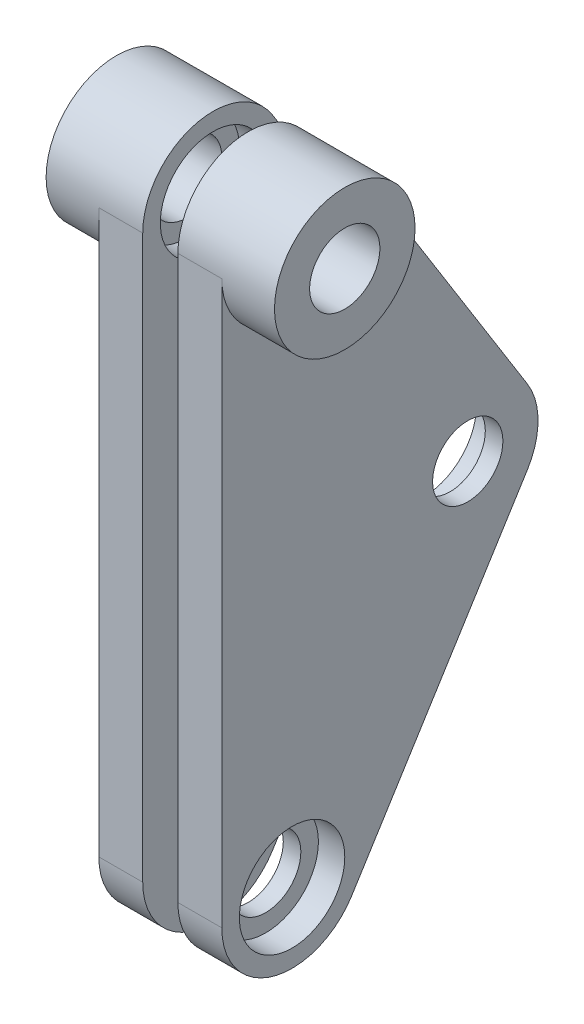
ISO-10303-21;
HEADER;
FILE_DESCRIPTION(('STEP AP214'),'2;1');
FILE_NAME('part.step','',(''),(''),'','','');
FILE_SCHEMA(('AUTOMOTIVE_DESIGN { 1 0 10303 214 1 1 1 1 }'));
ENDSEC;
DATA;
#1=APPLICATION_CONTEXT('core data for automotive mechanical design processes');
#2=APPLICATION_PROTOCOL_DEFINITION('international standard','automotive_design',2000,#1);
#3=PRODUCT_CONTEXT('',#1,'mechanical');
#4=PRODUCT('Part','Part','',(#3));
#5=PRODUCT_RELATED_PRODUCT_CATEGORY('part','',(#4));
#6=PRODUCT_DEFINITION_FORMATION('','',#4);
#7=PRODUCT_DEFINITION_CONTEXT('part definition',#1,'design');
#8=PRODUCT_DEFINITION('design','',#6,#7);
#9=PRODUCT_DEFINITION_SHAPE('','',#8);
#10=(LENGTH_UNIT() NAMED_UNIT(*) SI_UNIT(.MILLI.,.METRE.));
#11=(NAMED_UNIT(*) PLANE_ANGLE_UNIT() SI_UNIT($,.RADIAN.));
#12=(NAMED_UNIT(*) SI_UNIT($,.STERADIAN.) SOLID_ANGLE_UNIT());
#13=UNCERTAINTY_MEASURE_WITH_UNIT(LENGTH_MEASURE(1.E-05),#10,'distance_accuracy_value','');
#14=(GEOMETRIC_REPRESENTATION_CONTEXT(3) GLOBAL_UNCERTAINTY_ASSIGNED_CONTEXT((#13)) GLOBAL_UNIT_ASSIGNED_CONTEXT((#10,
#11,#12)) REPRESENTATION_CONTEXT('',''));
#15=CARTESIAN_POINT('',(0.,0.,0.));
#16=DIRECTION('',(0.,0.,1.));
#17=DIRECTION('',(1.,0.,0.));
#18=AXIS2_PLACEMENT_3D('',#15,#16,#17);
#19=CARTESIAN_POINT('',(4.5,-4.,-4.));
#20=DIRECTION('',(1.,0.,0.));
#21=DIRECTION('',(0.,0.,1.));
#22=AXIS2_PLACEMENT_3D('',#19,#20,#21);
#23=CYLINDRICAL_SURFACE('',#22,2.);
#24=CARTESIAN_POINT('',(10.,-4.,-4.));
#25=DIRECTION('',(1.,0.,0.));
#26=DIRECTION('',(0.,0.,-1.));
#27=AXIS2_PLACEMENT_3D('',#24,#25,#26);
#28=CIRCLE('',#27,2.);
#29=CARTESIAN_POINT('',(10.,-4.,-6.));
#30=VERTEX_POINT('',#29);
#31=EDGE_CURVE('E220',#30,#30,#28,.T.);
#32=ORIENTED_EDGE('',*,*,#31,.T.);
#33=EDGE_LOOP('',(#32));
#34=FACE_BOUND('',#33,.T.);
#35=CARTESIAN_POINT('',(6.,-4.,-4.));
#36=DIRECTION('',(1.,0.,0.));
#37=DIRECTION('',(0.,0.,-1.));
#38=AXIS2_PLACEMENT_3D('',#35,#36,#37);
#39=CIRCLE('',#38,2.);
#40=CARTESIAN_POINT('',(6.,-4.,-6.));
#41=VERTEX_POINT('',#40);
#42=EDGE_CURVE('E223',#41,#41,#39,.F.);
#43=ORIENTED_EDGE('',*,*,#42,.T.);
#44=EDGE_LOOP('',(#43));
#45=FACE_BOUND('',#44,.T.);
#46=ADVANCED_FACE('F110',(#34,#45),#23,.F.);
#47=CARTESIAN_POINT('',(4.5,-20.,-14.));
#48=DIRECTION('',(1.,0.,0.));
#49=DIRECTION('',(0.,0.,1.));
#50=AXIS2_PLACEMENT_3D('',#47,#48,#49);
#51=CYLINDRICAL_SURFACE('',#50,2.);
#52=CARTESIAN_POINT('',(7.,-20.,-14.));
#53=DIRECTION('',(1.,0.,0.));
#54=DIRECTION('',(0.,0.,-1.));
#55=AXIS2_PLACEMENT_3D('',#52,#53,#54);
#56=CIRCLE('',#55,2.);
#57=CARTESIAN_POINT('',(7.,-20.,-16.));
#58=VERTEX_POINT('',#57);
#59=EDGE_CURVE('E241',#58,#58,#56,.F.);
#60=ORIENTED_EDGE('',*,*,#59,.F.);
#61=EDGE_LOOP('',(#60));
#62=FACE_BOUND('',#61,.T.);
#63=CARTESIAN_POINT('',(6.,-20.,-14.));
#64=DIRECTION('',(1.,0.,0.));
#65=DIRECTION('',(0.,0.,-1.));
#66=AXIS2_PLACEMENT_3D('',#63,#64,#65);
#67=CIRCLE('',#66,2.);
#68=CARTESIAN_POINT('',(6.,-20.,-16.));
#69=VERTEX_POINT('',#68);
#70=EDGE_CURVE('E213',#69,#69,#67,.T.);
#71=ORIENTED_EDGE('',*,*,#70,.F.);
#72=EDGE_LOOP('',(#71));
#73=FACE_BOUND('',#72,.T.);
#74=ADVANCED_FACE('F264',(#62,#73),#51,.F.);
#75=CARTESIAN_POINT('',(4.5,2.79415306338351,-4.47064490141361));
#76=DIRECTION('',(0.,0.52999894000318,-0.847998304005088));
#77=DIRECTION('',(0.,0.847998304005088,0.52999894000318));
#78=AXIS2_PLACEMENT_3D('',#75,#76,#77);
#79=PLANE('',#78);
#80=DIRECTION('',(0.,-0.847998304005088,-0.52999894000318));
#81=VECTOR('',#80,1.);
#82=CARTESIAN_POINT('',(7.,2.79415306338351,-4.47064490141361));
#83=LINE('',#82,#81);
#84=CARTESIAN_POINT('',(7.,-1.88000423998728,-7.39199321602035));
#85=VERTEX_POINT('',#84);
#86=CARTESIAN_POINT('',(7.,-17.8800042399873,-17.3919932160204));
#87=VERTEX_POINT('',#86);
#88=EDGE_CURVE('E194',#85,#87,#83,.T.);
#89=ORIENTED_EDGE('',*,*,#88,.T.);
#90=DIRECTION('',(1.,0.,0.));
#91=VECTOR('',#90,1.);
#92=CARTESIAN_POINT('',(4.5,-17.8800042399873,-17.3919932160204));
#93=LINE('',#92,#91);
#94=CARTESIAN_POINT('',(4.5,-17.8800042399873,-17.3919932160204));
#95=VERTEX_POINT('',#94);
#96=EDGE_CURVE('E120',#95,#87,#93,.T.);
#97=ORIENTED_EDGE('',*,*,#96,.F.);
#98=DIRECTION('',(0.,-0.847998304005088,-0.52999894000318));
#99=VECTOR('',#98,1.);
#100=CARTESIAN_POINT('',(4.5,2.79415306338351,-4.47064490141361));
#101=LINE('',#100,#99);
#102=CARTESIAN_POINT('',(4.5,-1.88000423998728,-7.39199321602035));
#103=VERTEX_POINT('',#102);
#104=EDGE_CURVE('E187',#103,#95,#101,.T.);
#105=ORIENTED_EDGE('',*,*,#104,.F.);
#106=DIRECTION('',(1.,0.,0.));
#107=VECTOR('',#106,1.);
#108=CARTESIAN_POINT('',(4.5,-1.88000423998728,-7.39199321602035));
#109=LINE('',#108,#107);
#110=EDGE_CURVE('E205',#103,#85,#109,.T.);
#111=ORIENTED_EDGE('',*,*,#110,.T.);
#112=EDGE_LOOP('',(#89,#97,#105,#111));
#113=FACE_BOUND('',#112,.T.);
#114=ADVANCED_FACE('F270',(#113),#79,.T.);
#115=CARTESIAN_POINT('',(4.5,0.,0.));
#116=DIRECTION('',(0.,0.,-1.));
#117=DIRECTION('',(1.,0.,0.));
#118=AXIS2_PLACEMENT_3D('',#115,#116,#117);
#119=PLANE('',#118);
#120=DIRECTION('',(0.,-1.,0.));
#121=VECTOR('',#120,1.);
#122=CARTESIAN_POINT('',(7.,0.,0.));
#123=LINE('',#122,#121);
#124=CARTESIAN_POINT('',(7.,-4.,0.));
#125=VERTEX_POINT('',#124);
#126=CARTESIAN_POINT('',(7.,-36.,0.));
#127=VERTEX_POINT('',#126);
#128=EDGE_CURVE('E197',#125,#127,#123,.T.);
#129=ORIENTED_EDGE('',*,*,#128,.F.);
#130=DIRECTION('',(1.,0.,0.));
#131=VECTOR('',#130,1.);
#132=CARTESIAN_POINT('',(4.5,-4.,0.));
#133=LINE('',#132,#131);
#134=CARTESIAN_POINT('',(4.5,-4.,0.));
#135=VERTEX_POINT('',#134);
#136=EDGE_CURVE('E182',#135,#125,#133,.T.);
#137=ORIENTED_EDGE('',*,*,#136,.F.);
#138=DIRECTION('',(0.,-1.,0.));
#139=VECTOR('',#138,1.);
#140=CARTESIAN_POINT('',(4.5,0.,0.));
#141=LINE('',#140,#139);
#142=CARTESIAN_POINT('',(4.5,-36.,0.));
#143=VERTEX_POINT('',#142);
#144=EDGE_CURVE('E171',#135,#143,#141,.T.);
#145=ORIENTED_EDGE('',*,*,#144,.T.);
#146=DIRECTION('',(1.,0.,0.));
#147=VECTOR('',#146,1.);
#148=CARTESIAN_POINT('',(4.5,-36.,0.));
#149=LINE('',#148,#147);
#150=EDGE_CURVE('E179',#143,#127,#149,.T.);
#151=ORIENTED_EDGE('',*,*,#150,.T.);
#152=EDGE_LOOP('',(#129,#137,#145,#151));
#153=FACE_BOUND('',#152,.T.);
#154=ADVANCED_FACE('F185',(#153),#119,.F.);
#155=CARTESIAN_POINT('',(4.5,-14.0301081195633,-22.4481729913013));
#156=DIRECTION('',(0.,-0.52999894000318,-0.847998304005088));
#157=DIRECTION('',(0.,0.847998304005088,-0.52999894000318));
#158=AXIS2_PLACEMENT_3D('',#155,#156,#157);
#159=PLANE('',#158);
#160=DIRECTION('',(0.,-0.847998304005088,0.52999894000318));
#161=VECTOR('',#160,1.);
#162=CARTESIAN_POINT('',(7.,-14.0301081195633,-22.4481729913013));
#163=LINE('',#162,#161);
#164=CARTESIAN_POINT('',(7.,-22.1199957600127,-17.3919932160204));
#165=VERTEX_POINT('',#164);
#166=CARTESIAN_POINT('',(7.,-38.1199957600127,-7.39199321602035));
#167=VERTEX_POINT('',#166);
#168=EDGE_CURVE('E191',#165,#167,#163,.T.);
#169=ORIENTED_EDGE('',*,*,#168,.T.);
#170=DIRECTION('',(1.,0.,0.));
#171=VECTOR('',#170,1.);
#172=CARTESIAN_POINT('',(4.5,-38.1199957600127,-7.39199321602035));
#173=LINE('',#172,#171);
#174=CARTESIAN_POINT('',(4.5,-38.1199957600127,-7.39199321602035));
#175=VERTEX_POINT('',#174);
#176=EDGE_CURVE('E183',#175,#167,#173,.T.);
#177=ORIENTED_EDGE('',*,*,#176,.F.);
#178=DIRECTION('',(0.,-0.847998304005088,0.52999894000318));
#179=VECTOR('',#178,1.);
#180=CARTESIAN_POINT('',(4.5,-14.0301081195633,-22.4481729913013));
#181=LINE('',#180,#179);
#182=CARTESIAN_POINT('',(4.5,-22.1199957600127,-17.3919932160204));
#183=VERTEX_POINT('',#182);
#184=EDGE_CURVE('E174',#183,#175,#181,.T.);
#185=ORIENTED_EDGE('',*,*,#184,.F.);
#186=DIRECTION('',(1.,0.,0.));
#187=VECTOR('',#186,1.);
#188=CARTESIAN_POINT('',(4.5,-22.1199957600127,-17.3919932160204));
#189=LINE('',#188,#187);
#190=EDGE_CURVE('E189',#183,#165,#189,.T.);
#191=ORIENTED_EDGE('',*,*,#190,.T.);
#192=EDGE_LOOP('',(#169,#177,#185,#191));
#193=FACE_BOUND('',#192,.T.);
#194=ADVANCED_FACE('F288',(#193),#159,.T.);
#195=CARTESIAN_POINT('',(7.,0.,0.));
#196=DIRECTION('',(-1.,0.,0.));
#197=DIRECTION('',(0.,0.,-1.));
#198=AXIS2_PLACEMENT_3D('',#195,#196,#197);
#199=PLANE('',#198);
#200=CARTESIAN_POINT('',(7.,-36.,-4.));
#201=DIRECTION('',(1.,0.,0.));
#202=DIRECTION('',(0.,0.,-1.));
#203=AXIS2_PLACEMENT_3D('',#200,#201,#202);
#204=CIRCLE('',#203,3.);
#205=CARTESIAN_POINT('',(7.,-36.,-7.));
#206=VERTEX_POINT('',#205);
#207=EDGE_CURVE('E411',#206,#206,#204,.T.);
#208=ORIENTED_EDGE('',*,*,#207,.F.);
#209=EDGE_LOOP('',(#208));
#210=FACE_BOUND('',#209,.T.);
#211=ORIENTED_EDGE('',*,*,#59,.T.);
#212=EDGE_LOOP('',(#211));
#213=FACE_BOUND('',#212,.T.);
#214=ORIENTED_EDGE('',*,*,#128,.T.);
#215=CARTESIAN_POINT('',(7.,-36.,-4.));
#216=DIRECTION('',(1.,0.,0.));
#217=DIRECTION('',(0.,0.,-1.));
#218=AXIS2_PLACEMENT_3D('',#215,#216,#217);
#219=CIRCLE('',#218,4.);
#220=EDGE_CURVE('E149',#127,#167,#219,.T.);
#221=ORIENTED_EDGE('',*,*,#220,.T.);
#222=ORIENTED_EDGE('',*,*,#168,.F.);
#223=CARTESIAN_POINT('',(7.,-20.,-14.));
#224=DIRECTION('',(1.,0.,0.));
#225=DIRECTION('',(0.,0.,-1.));
#226=AXIS2_PLACEMENT_3D('',#223,#224,#225);
#227=CIRCLE('',#226,4.);
#228=EDGE_CURVE('E155',#165,#87,#227,.T.);
#229=ORIENTED_EDGE('',*,*,#228,.T.);
#230=ORIENTED_EDGE('',*,*,#88,.F.);
#231=CARTESIAN_POINT('',(7.,-4.,-4.));
#232=DIRECTION('',(1.,0.,0.));
#233=DIRECTION('',(0.,0.,-1.));
#234=AXIS2_PLACEMENT_3D('',#231,#232,#233);
#235=CIRCLE('',#234,4.);
#236=EDGE_CURVE('E13',#125,#85,#235,.T.);
#237=ORIENTED_EDGE('',*,*,#236,.F.);
#238=EDGE_LOOP('',(#214,#221,#222,#229,#230,#237));
#239=FACE_BOUND('',#238,.T.);
#240=ADVANCED_FACE('F284',(#210,#213,#239),#199,.F.);
#241=CARTESIAN_POINT('',(4.5,0.,0.));
#242=DIRECTION('',(-1.,0.,0.));
#243=DIRECTION('',(0.,0.,-1.));
#244=AXIS2_PLACEMENT_3D('',#241,#242,#243);
#245=PLANE('',#244);
#246=CARTESIAN_POINT('',(4.5,-4.,-4.));
#247=DIRECTION('',(1.,0.,0.));
#248=DIRECTION('',(0.,0.,-1.));
#249=AXIS2_PLACEMENT_3D('',#246,#247,#248);
#250=CIRCLE('',#249,3.);
#251=CARTESIAN_POINT('',(4.5,-4.,-7.));
#252=VERTEX_POINT('',#251);
#253=EDGE_CURVE('E228',#252,#252,#250,.T.);
#254=ORIENTED_EDGE('',*,*,#253,.T.);
#255=EDGE_LOOP('',(#254));
#256=FACE_BOUND('',#255,.T.);
#257=CARTESIAN_POINT('',(4.5,-20.,-14.));
#258=DIRECTION('',(1.,0.,0.));
#259=DIRECTION('',(0.,0.,-1.));
#260=AXIS2_PLACEMENT_3D('',#257,#258,#259);
#261=CIRCLE('',#260,3.);
#262=CARTESIAN_POINT('',(4.5,-20.,-17.));
#263=VERTEX_POINT('',#262);
#264=EDGE_CURVE('E234',#263,#263,#261,.T.);
#265=ORIENTED_EDGE('',*,*,#264,.T.);
#266=EDGE_LOOP('',(#265));
#267=FACE_BOUND('',#266,.T.);
#268=CARTESIAN_POINT('',(4.5,-36.,-4.));
#269=DIRECTION('',(1.,0.,0.));
#270=DIRECTION('',(0.,0.,-1.));
#271=AXIS2_PLACEMENT_3D('',#268,#269,#270);
#272=CIRCLE('',#271,2.);
#273=CARTESIAN_POINT('',(4.5,-36.,-6.));
#274=VERTEX_POINT('',#273);
#275=EDGE_CURVE('E215',#274,#274,#272,.T.);
#276=ORIENTED_EDGE('',*,*,#275,.T.);
#277=EDGE_LOOP('',(#276));
#278=FACE_BOUND('',#277,.T.);
#279=ORIENTED_EDGE('',*,*,#184,.T.);
#280=CARTESIAN_POINT('',(4.5,-36.,-4.));
#281=DIRECTION('',(1.,0.,0.));
#282=DIRECTION('',(0.,0.,-1.));
#283=AXIS2_PLACEMENT_3D('',#280,#281,#282);
#284=CIRCLE('',#283,4.);
#285=EDGE_CURVE('E167',#143,#175,#284,.T.);
#286=ORIENTED_EDGE('',*,*,#285,.F.);
#287=ORIENTED_EDGE('',*,*,#144,.F.);
#288=CARTESIAN_POINT('',(4.5,-4.,-4.));
#289=DIRECTION('',(1.,0.,0.));
#290=DIRECTION('',(0.,0.,-1.));
#291=AXIS2_PLACEMENT_3D('',#288,#289,#290);
#292=CIRCLE('',#291,4.);
#293=EDGE_CURVE('E198',#103,#135,#292,.T.);
#294=ORIENTED_EDGE('',*,*,#293,.F.);
#295=ORIENTED_EDGE('',*,*,#104,.T.);
#296=CARTESIAN_POINT('',(4.5,-20.,-14.));
#297=DIRECTION('',(1.,0.,0.));
#298=DIRECTION('',(0.,0.,-1.));
#299=AXIS2_PLACEMENT_3D('',#296,#297,#298);
#300=CIRCLE('',#299,4.);
#301=EDGE_CURVE('E129',#183,#95,#300,.T.);
#302=ORIENTED_EDGE('',*,*,#301,.F.);
#303=EDGE_LOOP('',(#279,#286,#287,#294,#295,#302));
#304=FACE_BOUND('',#303,.T.);
#305=ADVANCED_FACE('F169',(#256,#267,#278,#304),#245,.T.);
#306=CARTESIAN_POINT('',(4.5,-36.,-4.));
#307=DIRECTION('',(1.,0.,0.));
#308=DIRECTION('',(0.,0.,1.));
#309=AXIS2_PLACEMENT_3D('',#306,#307,#308);
#310=CYLINDRICAL_SURFACE('',#309,4.);
#311=ORIENTED_EDGE('',*,*,#285,.T.);
#312=ORIENTED_EDGE('',*,*,#176,.T.);
#313=ORIENTED_EDGE('',*,*,#220,.F.);
#314=ORIENTED_EDGE('',*,*,#150,.F.);
#315=EDGE_LOOP('',(#311,#312,#313,#314));
#316=FACE_BOUND('',#315,.T.);
#317=ADVANCED_FACE('F112',(#316),#310,.T.);
#318=CARTESIAN_POINT('',(4.5,-20.,-14.));
#319=DIRECTION('',(1.,0.,0.));
#320=DIRECTION('',(0.,0.,1.));
#321=AXIS2_PLACEMENT_3D('',#318,#319,#320);
#322=CYLINDRICAL_SURFACE('',#321,4.);
#323=ORIENTED_EDGE('',*,*,#228,.F.);
#324=ORIENTED_EDGE('',*,*,#190,.F.);
#325=ORIENTED_EDGE('',*,*,#301,.T.);
#326=ORIENTED_EDGE('',*,*,#96,.T.);
#327=EDGE_LOOP('',(#323,#324,#325,#326));
#328=FACE_BOUND('',#327,.T.);
#329=ADVANCED_FACE('F252',(#328),#322,.T.);
#330=CARTESIAN_POINT('',(4.5,-4.,-4.));
#331=DIRECTION('',(1.,0.,0.));
#332=DIRECTION('',(0.,0.,1.));
#333=AXIS2_PLACEMENT_3D('',#330,#331,#332);
#334=CYLINDRICAL_SURFACE('',#333,4.);
#335=ORIENTED_EDGE('',*,*,#293,.T.);
#336=ORIENTED_EDGE('',*,*,#136,.T.);
#337=ORIENTED_EDGE('',*,*,#236,.T.);
#338=ORIENTED_EDGE('',*,*,#110,.F.);
#339=EDGE_LOOP('',(#335,#336,#337,#338));
#340=FACE_BOUND('',#339,.T.);
#341=CARTESIAN_POINT('',(10.,-4.,-4.));
#342=DIRECTION('',(1.,0.,0.));
#343=DIRECTION('',(0.,0.,-1.));
#344=AXIS2_PLACEMENT_3D('',#341,#342,#343);
#345=CIRCLE('',#344,4.);
#346=CARTESIAN_POINT('',(10.,-4.,-8.));
#347=VERTEX_POINT('',#346);
#348=EDGE_CURVE('E212',#347,#347,#345,.T.);
#349=ORIENTED_EDGE('',*,*,#348,.F.);
#350=EDGE_LOOP('',(#349));
#351=FACE_BOUND('',#350,.T.);
#352=ADVANCED_FACE('F250',(#340,#351),#334,.T.);
#353=CARTESIAN_POINT('',(10.,-4.,-4.));
#354=DIRECTION('',(-1.,0.,0.));
#355=DIRECTION('',(0.,0.,-1.));
#356=AXIS2_PLACEMENT_3D('',#353,#354,#355);
#357=PLANE('',#356);
#358=ORIENTED_EDGE('',*,*,#31,.F.);
#359=EDGE_LOOP('',(#358));
#360=FACE_BOUND('',#359,.T.);
#361=ORIENTED_EDGE('',*,*,#348,.T.);
#362=EDGE_LOOP('',(#361));
#363=FACE_BOUND('',#362,.T.);
#364=ADVANCED_FACE('F248',(#360,#363),#357,.F.);
#365=CARTESIAN_POINT('',(4.5,-36.,-4.));
#366=DIRECTION('',(1.,0.,0.));
#367=DIRECTION('',(0.,0.,1.));
#368=AXIS2_PLACEMENT_3D('',#365,#366,#367);
#369=CYLINDRICAL_SURFACE('',#368,2.);
#370=CARTESIAN_POINT('',(5.5,-36.,-4.));
#371=DIRECTION('',(1.,0.,0.));
#372=DIRECTION('',(0.,0.,-1.));
#373=AXIS2_PLACEMENT_3D('',#370,#371,#372);
#374=CIRCLE('',#373,2.);
#375=CARTESIAN_POINT('',(5.5,-36.,-6.));
#376=VERTEX_POINT('',#375);
#377=EDGE_CURVE('E114',#376,#376,#374,.T.);
#378=ORIENTED_EDGE('',*,*,#377,.T.);
#379=EDGE_LOOP('',(#378));
#380=FACE_BOUND('',#379,.T.);
#381=ORIENTED_EDGE('',*,*,#275,.F.);
#382=EDGE_LOOP('',(#381));
#383=FACE_BOUND('',#382,.T.);
#384=ADVANCED_FACE('F259',(#380,#383),#369,.F.);
#385=CARTESIAN_POINT('',(6.,-20.,-14.));
#386=DIRECTION('',(-1.,0.,0.));
#387=DIRECTION('',(0.,0.,-1.));
#388=AXIS2_PLACEMENT_3D('',#385,#386,#387);
#389=CYLINDRICAL_SURFACE('',#388,3.);
#390=CARTESIAN_POINT('',(6.,-20.,-14.));
#391=DIRECTION('',(1.,0.,0.));
#392=DIRECTION('',(0.,0.,-1.));
#393=AXIS2_PLACEMENT_3D('',#390,#391,#392);
#394=CIRCLE('',#393,3.);
#395=CARTESIAN_POINT('',(6.,-20.,-17.));
#396=VERTEX_POINT('',#395);
#397=EDGE_CURVE('E237',#396,#396,#394,.T.);
#398=ORIENTED_EDGE('',*,*,#397,.T.);
#399=EDGE_LOOP('',(#398));
#400=FACE_BOUND('',#399,.T.);
#401=ORIENTED_EDGE('',*,*,#264,.F.);
#402=EDGE_LOOP('',(#401));
#403=FACE_BOUND('',#402,.T.);
#404=ADVANCED_FACE('F279',(#400,#403),#389,.F.);
#405=CARTESIAN_POINT('',(6.,-20.,-14.));
#406=DIRECTION('',(-1.,0.,0.));
#407=DIRECTION('',(0.,0.,-1.));
#408=AXIS2_PLACEMENT_3D('',#405,#406,#407);
#409=PLANE('',#408);
#410=ORIENTED_EDGE('',*,*,#70,.T.);
#411=EDGE_LOOP('',(#410));
#412=FACE_BOUND('',#411,.T.);
#413=ORIENTED_EDGE('',*,*,#397,.F.);
#414=EDGE_LOOP('',(#413));
#415=FACE_BOUND('',#414,.T.);
#416=ADVANCED_FACE('F275',(#412,#415),#409,.T.);
#417=CARTESIAN_POINT('',(6.,-4.,-4.));
#418=DIRECTION('',(-1.,0.,0.));
#419=DIRECTION('',(0.,0.,-1.));
#420=AXIS2_PLACEMENT_3D('',#417,#418,#419);
#421=CYLINDRICAL_SURFACE('',#420,3.);
#422=CARTESIAN_POINT('',(6.,-4.,-4.));
#423=DIRECTION('',(1.,0.,0.));
#424=DIRECTION('',(0.,0.,-1.));
#425=AXIS2_PLACEMENT_3D('',#422,#423,#424);
#426=CIRCLE('',#425,3.);
#427=CARTESIAN_POINT('',(6.,-4.,-7.));
#428=VERTEX_POINT('',#427);
#429=EDGE_CURVE('E216',#428,#428,#426,.T.);
#430=ORIENTED_EDGE('',*,*,#429,.T.);
#431=EDGE_LOOP('',(#430));
#432=FACE_BOUND('',#431,.T.);
#433=ORIENTED_EDGE('',*,*,#253,.F.);
#434=EDGE_LOOP('',(#433));
#435=FACE_BOUND('',#434,.T.);
#436=ADVANCED_FACE('F364',(#432,#435),#421,.F.);
#437=CARTESIAN_POINT('',(6.,0.,0.));
#438=DIRECTION('',(-1.,0.,0.));
#439=DIRECTION('',(0.,0.,-1.));
#440=AXIS2_PLACEMENT_3D('',#437,#438,#439);
#441=PLANE('',#440);
#442=ORIENTED_EDGE('',*,*,#42,.F.);
#443=EDGE_LOOP('',(#442));
#444=FACE_BOUND('',#443,.T.);
#445=ORIENTED_EDGE('',*,*,#429,.F.);
#446=EDGE_LOOP('',(#445));
#447=FACE_BOUND('',#446,.T.);
#448=ADVANCED_FACE('F372',(#444,#447),#441,.T.);
#449=CARTESIAN_POINT('',(5.5,-36.,-4.));
#450=DIRECTION('',(1.,0.,0.));
#451=DIRECTION('',(0.,0.,1.));
#452=AXIS2_PLACEMENT_3D('',#449,#450,#451);
#453=CYLINDRICAL_SURFACE('',#452,3.);
#454=CARTESIAN_POINT('',(5.5,-36.,-4.));
#455=DIRECTION('',(1.,0.,0.));
#456=DIRECTION('',(0.,0.,-1.));
#457=AXIS2_PLACEMENT_3D('',#454,#455,#456);
#458=CIRCLE('',#457,3.);
#459=CARTESIAN_POINT('',(5.5,-36.,-7.));
#460=VERTEX_POINT('',#459);
#461=EDGE_CURVE('E410',#460,#460,#458,.T.);
#462=ORIENTED_EDGE('',*,*,#461,.F.);
#463=EDGE_LOOP('',(#462));
#464=FACE_BOUND('',#463,.T.);
#465=ORIENTED_EDGE('',*,*,#207,.T.);
#466=EDGE_LOOP('',(#465));
#467=FACE_BOUND('',#466,.T.);
#468=ADVANCED_FACE('F381',(#464,#467),#453,.F.);
#469=CARTESIAN_POINT('',(5.5,-36.,-4.));
#470=DIRECTION('',(-1.,0.,0.));
#471=DIRECTION('',(0.,0.,-1.));
#472=AXIS2_PLACEMENT_3D('',#469,#470,#471);
#473=PLANE('',#472);
#474=ORIENTED_EDGE('',*,*,#377,.F.);
#475=EDGE_LOOP('',(#474));
#476=FACE_BOUND('',#475,.T.);
#477=ORIENTED_EDGE('',*,*,#461,.T.);
#478=EDGE_LOOP('',(#477));
#479=FACE_BOUND('',#478,.T.);
#480=ADVANCED_FACE('F391',(#476,#479),#473,.F.);
#481=CLOSED_SHELL('',(#46,#74,#114,#154,#194,#240,#305,#317,#329,#352,#364,#384,#404,#416,#436,
#448,#468,#480));
#482=MANIFOLD_SOLID_BREP('B2',#481);
#483=CARTESIAN_POINT('',(2.5,-4.,-4.));
#484=DIRECTION('',(-1.,0.,0.));
#485=DIRECTION('',(0.,0.,1.));
#486=AXIS2_PLACEMENT_3D('',#483,#484,#485);
#487=CYLINDRICAL_SURFACE('',#486,2.);
#488=CARTESIAN_POINT('',(-3.,-4.,-4.));
#489=DIRECTION('',(1.,0.,0.));
#490=DIRECTION('',(0.,0.,-1.));
#491=AXIS2_PLACEMENT_3D('',#488,#489,#490);
#492=CIRCLE('',#491,2.);
#493=CARTESIAN_POINT('',(-3.,-4.,-6.));
#494=VERTEX_POINT('',#493);
#495=EDGE_CURVE('E570',#494,#494,#492,.T.);
#496=ORIENTED_EDGE('',*,*,#495,.F.);
#497=EDGE_LOOP('',(#496));
#498=FACE_BOUND('',#497,.T.);
#499=CARTESIAN_POINT('',(1.,-4.,-4.));
#500=DIRECTION('',(1.,0.,0.));
#501=DIRECTION('',(0.,0.,-1.));
#502=AXIS2_PLACEMENT_3D('',#499,#500,#501);
#503=CIRCLE('',#502,2.);
#504=CARTESIAN_POINT('',(1.,-4.,-6.));
#505=VERTEX_POINT('',#504);
#506=EDGE_CURVE('E573',#505,#505,#503,.F.);
#507=ORIENTED_EDGE('',*,*,#506,.F.);
#508=EDGE_LOOP('',(#507));
#509=FACE_BOUND('',#508,.T.);
#510=ADVANCED_FACE('F457',(#498,#509),#487,.F.);
#511=CARTESIAN_POINT('',(2.5,-20.,-14.));
#512=DIRECTION('',(-1.,0.,0.));
#513=DIRECTION('',(0.,0.,1.));
#514=AXIS2_PLACEMENT_3D('',#511,#512,#513);
#515=CYLINDRICAL_SURFACE('',#514,2.);
#516=CARTESIAN_POINT('',(0.,-20.,-14.));
#517=DIRECTION('',(1.,0.,0.));
#518=DIRECTION('',(0.,0.,-1.));
#519=AXIS2_PLACEMENT_3D('',#516,#517,#518);
#520=CIRCLE('',#519,2.);
#521=CARTESIAN_POINT('',(0.,-20.,-16.));
#522=VERTEX_POINT('',#521);
#523=EDGE_CURVE('E591',#522,#522,#520,.F.);
#524=ORIENTED_EDGE('',*,*,#523,.T.);
#525=EDGE_LOOP('',(#524));
#526=FACE_BOUND('',#525,.T.);
#527=CARTESIAN_POINT('',(1.,-20.,-14.));
#528=DIRECTION('',(1.,0.,0.));
#529=DIRECTION('',(0.,0.,-1.));
#530=AXIS2_PLACEMENT_3D('',#527,#528,#529);
#531=CIRCLE('',#530,2.);
#532=CARTESIAN_POINT('',(1.,-20.,-16.));
#533=VERTEX_POINT('',#532);
#534=EDGE_CURVE('E563',#533,#533,#531,.T.);
#535=ORIENTED_EDGE('',*,*,#534,.T.);
#536=EDGE_LOOP('',(#535));
#537=FACE_BOUND('',#536,.T.);
#538=ADVANCED_FACE('F617',(#526,#537),#515,.F.);
#539=CARTESIAN_POINT('',(2.5,2.79415306338351,-4.47064490141361));
#540=DIRECTION('',(0.,0.52999894000318,-0.847998304005088));
#541=DIRECTION('',(0.,0.847998304005088,0.52999894000318));
#542=AXIS2_PLACEMENT_3D('',#539,#540,#541);
#543=PLANE('',#542);
#544=DIRECTION('',(0.,-0.847998304005088,-0.52999894000318));
#545=VECTOR('',#544,1.);
#546=CARTESIAN_POINT('',(0.,2.79415306338351,-4.47064490141361));
#547=LINE('',#546,#545);
#548=CARTESIAN_POINT('',(0.,-1.88000423998728,-7.39199321602035));
#549=VERTEX_POINT('',#548);
#550=CARTESIAN_POINT('',(0.,-17.8800042399873,-17.3919932160204));
#551=VERTEX_POINT('',#550);
#552=EDGE_CURVE('E545',#549,#551,#547,.T.);
#553=ORIENTED_EDGE('',*,*,#552,.F.);
#554=DIRECTION('',(-1.,0.,0.));
#555=VECTOR('',#554,1.);
#556=CARTESIAN_POINT('',(2.5,-1.88000423998728,-7.39199321602035));
#557=LINE('',#556,#555);
#558=CARTESIAN_POINT('',(2.5,-1.88000423998728,-7.39199321602035));
#559=VERTEX_POINT('',#558);
#560=EDGE_CURVE('E554',#559,#549,#557,.T.);
#561=ORIENTED_EDGE('',*,*,#560,.F.);
#562=DIRECTION('',(0.,-0.847998304005088,-0.52999894000318));
#563=VECTOR('',#562,1.);
#564=CARTESIAN_POINT('',(2.5,2.79415306338351,-4.47064490141361));
#565=LINE('',#564,#563);
#566=CARTESIAN_POINT('',(2.5,-17.8800042399873,-17.3919932160204));
#567=VERTEX_POINT('',#566);
#568=EDGE_CURVE('E538',#559,#567,#565,.T.);
#569=ORIENTED_EDGE('',*,*,#568,.T.);
#570=DIRECTION('',(-1.,0.,0.));
#571=VECTOR('',#570,1.);
#572=CARTESIAN_POINT('',(2.5,-17.8800042399873,-17.3919932160204));
#573=LINE('',#572,#571);
#574=EDGE_CURVE('E467',#567,#551,#573,.T.);
#575=ORIENTED_EDGE('',*,*,#574,.T.);
#576=EDGE_LOOP('',(#553,#561,#569,#575));
#577=FACE_BOUND('',#576,.T.);
#578=ADVANCED_FACE('F623',(#577),#543,.T.);
#579=CARTESIAN_POINT('',(2.5,0.,0.));
#580=DIRECTION('',(0.,0.,-1.));
#581=DIRECTION('',(-1.,0.,0.));
#582=AXIS2_PLACEMENT_3D('',#579,#580,#581);
#583=PLANE('',#582);
#584=DIRECTION('',(0.,-1.,0.));
#585=VECTOR('',#584,1.);
#586=CARTESIAN_POINT('',(0.,0.,0.));
#587=LINE('',#586,#585);
#588=CARTESIAN_POINT('',(0.,-4.,0.));
#589=VERTEX_POINT('',#588);
#590=CARTESIAN_POINT('',(0.,-36.,0.));
#591=VERTEX_POINT('',#590);
#592=EDGE_CURVE('E520',#589,#591,#587,.T.);
#593=ORIENTED_EDGE('',*,*,#592,.T.);
#594=DIRECTION('',(-1.,0.,0.));
#595=VECTOR('',#594,1.);
#596=CARTESIAN_POINT('',(2.5,-36.,0.));
#597=LINE('',#596,#595);
#598=CARTESIAN_POINT('',(2.5,-36.,0.));
#599=VERTEX_POINT('',#598);
#600=EDGE_CURVE('E513',#599,#591,#597,.T.);
#601=ORIENTED_EDGE('',*,*,#600,.F.);
#602=DIRECTION('',(0.,-1.,0.));
#603=VECTOR('',#602,1.);
#604=CARTESIAN_POINT('',(2.5,0.,0.));
#605=LINE('',#604,#603);
#606=CARTESIAN_POINT('',(2.5,-4.,0.));
#607=VERTEX_POINT('',#606);
#608=EDGE_CURVE('E518',#607,#599,#605,.T.);
#609=ORIENTED_EDGE('',*,*,#608,.F.);
#610=DIRECTION('',(-1.,0.,0.));
#611=VECTOR('',#610,1.);
#612=CARTESIAN_POINT('',(2.5,-4.,0.));
#613=LINE('',#612,#611);
#614=EDGE_CURVE('E523',#607,#589,#613,.T.);
#615=ORIENTED_EDGE('',*,*,#614,.T.);
#616=EDGE_LOOP('',(#593,#601,#609,#615));
#617=FACE_BOUND('',#616,.T.);
#618=ADVANCED_FACE('F515',(#617),#583,.F.);
#619=CARTESIAN_POINT('',(2.5,-14.0301081195633,-22.4481729913013));
#620=DIRECTION('',(0.,-0.52999894000318,-0.847998304005088));
#621=DIRECTION('',(0.,0.847998304005088,-0.52999894000318));
#622=AXIS2_PLACEMENT_3D('',#619,#620,#621);
#623=PLANE('',#622);
#624=DIRECTION('',(0.,-0.847998304005088,0.52999894000318));
#625=VECTOR('',#624,1.);
#626=CARTESIAN_POINT('',(0.,-14.0301081195633,-22.4481729913013));
#627=LINE('',#626,#625);
#628=CARTESIAN_POINT('',(0.,-22.1199957600127,-17.3919932160204));
#629=VERTEX_POINT('',#628);
#630=CARTESIAN_POINT('',(0.,-38.1199957600127,-7.39199321602035));
#631=VERTEX_POINT('',#630);
#632=EDGE_CURVE('E542',#629,#631,#627,.T.);
#633=ORIENTED_EDGE('',*,*,#632,.F.);
#634=DIRECTION('',(-1.,0.,0.));
#635=VECTOR('',#634,1.);
#636=CARTESIAN_POINT('',(2.5,-22.1199957600127,-17.3919932160204));
#637=LINE('',#636,#635);
#638=CARTESIAN_POINT('',(2.5,-22.1199957600127,-17.3919932160204));
#639=VERTEX_POINT('',#638);
#640=EDGE_CURVE('E476',#639,#629,#637,.T.);
#641=ORIENTED_EDGE('',*,*,#640,.F.);
#642=DIRECTION('',(0.,-0.847998304005088,0.52999894000318));
#643=VECTOR('',#642,1.);
#644=CARTESIAN_POINT('',(2.5,-14.0301081195633,-22.4481729913013));
#645=LINE('',#644,#643);
#646=CARTESIAN_POINT('',(2.5,-38.1199957600127,-7.39199321602035));
#647=VERTEX_POINT('',#646);
#648=EDGE_CURVE('E537',#639,#647,#645,.T.);
#649=ORIENTED_EDGE('',*,*,#648,.T.);
#650=DIRECTION('',(-1.,0.,0.));
#651=VECTOR('',#650,1.);
#652=CARTESIAN_POINT('',(2.5,-38.1199957600127,-7.39199321602035));
#653=LINE('',#652,#651);
#654=EDGE_CURVE('E493',#647,#631,#653,.T.);
#655=ORIENTED_EDGE('',*,*,#654,.T.);
#656=EDGE_LOOP('',(#633,#641,#649,#655));
#657=FACE_BOUND('',#656,.T.);
#658=ADVANCED_FACE('F668',(#657),#623,.T.);
#659=CARTESIAN_POINT('',(0.,0.,0.));
#660=DIRECTION('',(1.,0.,0.));
#661=DIRECTION('',(0.,0.,-1.));
#662=AXIS2_PLACEMENT_3D('',#659,#660,#661);
#663=PLANE('',#662);
#664=CARTESIAN_POINT('',(0.,-36.,-4.));
#665=DIRECTION('',(1.,0.,0.));
#666=DIRECTION('',(0.,0.,-1.));
#667=AXIS2_PLACEMENT_3D('',#664,#665,#666);
#668=CIRCLE('',#667,3.);
#669=CARTESIAN_POINT('',(0.,-36.,-7.));
#670=VERTEX_POINT('',#669);
#671=EDGE_CURVE('E659',#670,#670,#668,.T.);
#672=ORIENTED_EDGE('',*,*,#671,.T.);
#673=EDGE_LOOP('',(#672));
#674=FACE_BOUND('',#673,.T.);
#675=ORIENTED_EDGE('',*,*,#523,.F.);
#676=EDGE_LOOP('',(#675));
#677=FACE_BOUND('',#676,.T.);
#678=ORIENTED_EDGE('',*,*,#592,.F.);
#679=CARTESIAN_POINT('',(0.,-4.,-4.));
#680=DIRECTION('',(1.,0.,0.));
#681=DIRECTION('',(0.,0.,-1.));
#682=AXIS2_PLACEMENT_3D('',#679,#680,#681);
#683=CIRCLE('',#682,4.);
#684=EDGE_CURVE('E108',#589,#549,#683,.T.);
#685=ORIENTED_EDGE('',*,*,#684,.T.);
#686=ORIENTED_EDGE('',*,*,#552,.T.);
#687=CARTESIAN_POINT('',(0.,-20.,-14.));
#688=DIRECTION('',(1.,0.,0.));
#689=DIRECTION('',(0.,0.,-1.));
#690=AXIS2_PLACEMENT_3D('',#687,#688,#689);
#691=CIRCLE('',#690,4.);
#692=EDGE_CURVE('E529',#629,#551,#691,.T.);
#693=ORIENTED_EDGE('',*,*,#692,.F.);
#694=ORIENTED_EDGE('',*,*,#632,.T.);
#695=CARTESIAN_POINT('',(0.,-36.,-4.));
#696=DIRECTION('',(1.,0.,0.));
#697=DIRECTION('',(0.,0.,-1.));
#698=AXIS2_PLACEMENT_3D('',#695,#696,#697);
#699=CIRCLE('',#698,4.);
#700=EDGE_CURVE('E530',#591,#631,#699,.T.);
#701=ORIENTED_EDGE('',*,*,#700,.F.);
#702=EDGE_LOOP('',(#678,#685,#686,#693,#694,#701));
#703=FACE_BOUND('',#702,.T.);
#704=ADVANCED_FACE('F664',(#674,#677,#703),#663,.F.);
#705=CARTESIAN_POINT('',(2.5,0.,0.));
#706=DIRECTION('',(1.,0.,0.));
#707=DIRECTION('',(0.,0.,-1.));
#708=AXIS2_PLACEMENT_3D('',#705,#706,#707);
#709=PLANE('',#708);
#710=CARTESIAN_POINT('',(2.5,-4.,-4.));
#711=DIRECTION('',(1.,0.,0.));
#712=DIRECTION('',(0.,0.,-1.));
#713=AXIS2_PLACEMENT_3D('',#710,#711,#712);
#714=CIRCLE('',#713,3.);
#715=CARTESIAN_POINT('',(2.5,-4.,-7.));
#716=VERTEX_POINT('',#715);
#717=EDGE_CURVE('E578',#716,#716,#714,.T.);
#718=ORIENTED_EDGE('',*,*,#717,.F.);
#719=EDGE_LOOP('',(#718));
#720=FACE_BOUND('',#719,.T.);
#721=CARTESIAN_POINT('',(2.5,-20.,-14.));
#722=DIRECTION('',(1.,0.,0.));
#723=DIRECTION('',(0.,0.,-1.));
#724=AXIS2_PLACEMENT_3D('',#721,#722,#723);
#725=CIRCLE('',#724,3.);
#726=CARTESIAN_POINT('',(2.5,-20.,-17.));
#727=VERTEX_POINT('',#726);
#728=EDGE_CURVE('E584',#727,#727,#725,.T.);
#729=ORIENTED_EDGE('',*,*,#728,.F.);
#730=EDGE_LOOP('',(#729));
#731=FACE_BOUND('',#730,.T.);
#732=CARTESIAN_POINT('',(2.5,-36.,-4.));
#733=DIRECTION('',(1.,0.,0.));
#734=DIRECTION('',(0.,0.,-1.));
#735=AXIS2_PLACEMENT_3D('',#732,#733,#734);
#736=CIRCLE('',#735,2.);
#737=CARTESIAN_POINT('',(2.5,-36.,-6.));
#738=VERTEX_POINT('',#737);
#739=EDGE_CURVE('E565',#738,#738,#736,.T.);
#740=ORIENTED_EDGE('',*,*,#739,.F.);
#741=EDGE_LOOP('',(#740));
#742=FACE_BOUND('',#741,.T.);
#743=ORIENTED_EDGE('',*,*,#648,.F.);
#744=CARTESIAN_POINT('',(2.5,-20.,-14.));
#745=DIRECTION('',(1.,0.,0.));
#746=DIRECTION('',(0.,0.,-1.));
#747=AXIS2_PLACEMENT_3D('',#744,#745,#746);
#748=CIRCLE('',#747,4.);
#749=EDGE_CURVE('E559',#639,#567,#748,.T.);
#750=ORIENTED_EDGE('',*,*,#749,.T.);
#751=ORIENTED_EDGE('',*,*,#568,.F.);
#752=CARTESIAN_POINT('',(2.5,-4.,-4.));
#753=DIRECTION('',(1.,0.,0.));
#754=DIRECTION('',(0.,0.,-1.));
#755=AXIS2_PLACEMENT_3D('',#752,#753,#754);
#756=CIRCLE('',#755,4.);
#757=EDGE_CURVE('E536',#559,#607,#756,.T.);
#758=ORIENTED_EDGE('',*,*,#757,.T.);
#759=ORIENTED_EDGE('',*,*,#608,.T.);
#760=CARTESIAN_POINT('',(2.5,-36.,-4.));
#761=DIRECTION('',(1.,0.,0.));
#762=DIRECTION('',(0.,0.,-1.));
#763=AXIS2_PLACEMENT_3D('',#760,#761,#762);
#764=CIRCLE('',#763,4.);
#765=EDGE_CURVE('E526',#599,#647,#764,.T.);
#766=ORIENTED_EDGE('',*,*,#765,.T.);
#767=EDGE_LOOP('',(#743,#750,#751,#758,#759,#766));
#768=FACE_BOUND('',#767,.T.);
#769=ADVANCED_FACE('F533',(#720,#731,#742,#768),#709,.T.);
#770=CARTESIAN_POINT('',(2.5,-36.,-4.));
#771=DIRECTION('',(-1.,0.,0.));
#772=DIRECTION('',(0.,0.,1.));
#773=AXIS2_PLACEMENT_3D('',#770,#771,#772);
#774=CYLINDRICAL_SURFACE('',#773,4.);
#775=ORIENTED_EDGE('',*,*,#765,.F.);
#776=ORIENTED_EDGE('',*,*,#600,.T.);
#777=ORIENTED_EDGE('',*,*,#700,.T.);
#778=ORIENTED_EDGE('',*,*,#654,.F.);
#779=EDGE_LOOP('',(#775,#776,#777,#778));
#780=FACE_BOUND('',#779,.T.);
#781=ADVANCED_FACE('F459',(#780),#774,.T.);
#782=CARTESIAN_POINT('',(2.5,-20.,-14.));
#783=DIRECTION('',(-1.,0.,0.));
#784=DIRECTION('',(0.,0.,1.));
#785=AXIS2_PLACEMENT_3D('',#782,#783,#784);
#786=CYLINDRICAL_SURFACE('',#785,4.);
#787=ORIENTED_EDGE('',*,*,#692,.T.);
#788=ORIENTED_EDGE('',*,*,#574,.F.);
#789=ORIENTED_EDGE('',*,*,#749,.F.);
#790=ORIENTED_EDGE('',*,*,#640,.T.);
#791=EDGE_LOOP('',(#787,#788,#789,#790));
#792=FACE_BOUND('',#791,.T.);
#793=ADVANCED_FACE('F612',(#792),#786,.T.);
#794=CARTESIAN_POINT('',(2.5,-4.,-4.));
#795=DIRECTION('',(-1.,0.,0.));
#796=DIRECTION('',(0.,0.,1.));
#797=AXIS2_PLACEMENT_3D('',#794,#795,#796);
#798=CYLINDRICAL_SURFACE('',#797,4.);
#799=ORIENTED_EDGE('',*,*,#757,.F.);
#800=ORIENTED_EDGE('',*,*,#560,.T.);
#801=ORIENTED_EDGE('',*,*,#684,.F.);
#802=ORIENTED_EDGE('',*,*,#614,.F.);
#803=EDGE_LOOP('',(#799,#800,#801,#802));
#804=FACE_BOUND('',#803,.T.);
#805=CARTESIAN_POINT('',(-3.,-4.,-4.));
#806=DIRECTION('',(1.,0.,0.));
#807=DIRECTION('',(0.,0.,-1.));
#808=AXIS2_PLACEMENT_3D('',#805,#806,#807);
#809=CIRCLE('',#808,4.);
#810=CARTESIAN_POINT('',(-3.,-4.,-8.));
#811=VERTEX_POINT('',#810);
#812=EDGE_CURVE('E562',#811,#811,#809,.T.);
#813=ORIENTED_EDGE('',*,*,#812,.T.);
#814=EDGE_LOOP('',(#813));
#815=FACE_BOUND('',#814,.T.);
#816=ADVANCED_FACE('F598',(#804,#815),#798,.T.);
#817=CARTESIAN_POINT('',(-3.,-4.,-4.));
#818=DIRECTION('',(1.,0.,0.));
#819=DIRECTION('',(0.,0.,-1.));
#820=AXIS2_PLACEMENT_3D('',#817,#818,#819);
#821=PLANE('',#820);
#822=ORIENTED_EDGE('',*,*,#495,.T.);
#823=EDGE_LOOP('',(#822));
#824=FACE_BOUND('',#823,.T.);
#825=ORIENTED_EDGE('',*,*,#812,.F.);
#826=EDGE_LOOP('',(#825));
#827=FACE_BOUND('',#826,.T.);
#828=ADVANCED_FACE('F600',(#824,#827),#821,.F.);
#829=CARTESIAN_POINT('',(2.5,-36.,-4.));
#830=DIRECTION('',(-1.,0.,0.));
#831=DIRECTION('',(0.,0.,1.));
#832=AXIS2_PLACEMENT_3D('',#829,#830,#831);
#833=CYLINDRICAL_SURFACE('',#832,2.);
#834=CARTESIAN_POINT('',(1.5,-36.,-4.));
#835=DIRECTION('',(1.,0.,0.));
#836=DIRECTION('',(0.,0.,-1.));
#837=AXIS2_PLACEMENT_3D('',#834,#835,#836);
#838=CIRCLE('',#837,2.);
#839=CARTESIAN_POINT('',(1.5,-36.,-6.));
#840=VERTEX_POINT('',#839);
#841=EDGE_CURVE('E461',#840,#840,#838,.T.);
#842=ORIENTED_EDGE('',*,*,#841,.F.);
#843=EDGE_LOOP('',(#842));
#844=FACE_BOUND('',#843,.T.);
#845=ORIENTED_EDGE('',*,*,#739,.T.);
#846=EDGE_LOOP('',(#845));
#847=FACE_BOUND('',#846,.T.);
#848=ADVANCED_FACE('F602',(#844,#847),#833,.F.);
#849=CARTESIAN_POINT('',(1.,-20.,-14.));
#850=DIRECTION('',(1.,0.,0.));
#851=DIRECTION('',(0.,0.,-1.));
#852=AXIS2_PLACEMENT_3D('',#849,#850,#851);
#853=CYLINDRICAL_SURFACE('',#852,3.);
#854=CARTESIAN_POINT('',(1.,-20.,-14.));
#855=DIRECTION('',(1.,0.,0.));
#856=DIRECTION('',(0.,0.,-1.));
#857=AXIS2_PLACEMENT_3D('',#854,#855,#856);
#858=CIRCLE('',#857,3.);
#859=CARTESIAN_POINT('',(1.,-20.,-17.));
#860=VERTEX_POINT('',#859);
#861=EDGE_CURVE('E587',#860,#860,#858,.T.);
#862=ORIENTED_EDGE('',*,*,#861,.F.);
#863=EDGE_LOOP('',(#862));
#864=FACE_BOUND('',#863,.T.);
#865=ORIENTED_EDGE('',*,*,#728,.T.);
#866=EDGE_LOOP('',(#865));
#867=FACE_BOUND('',#866,.T.);
#868=ADVANCED_FACE('F609',(#864,#867),#853,.F.);
#869=CARTESIAN_POINT('',(1.,-20.,-14.));
#870=DIRECTION('',(1.,0.,0.));
#871=DIRECTION('',(0.,0.,-1.));
#872=AXIS2_PLACEMENT_3D('',#869,#870,#871);
#873=PLANE('',#872);
#874=ORIENTED_EDGE('',*,*,#534,.F.);
#875=EDGE_LOOP('',(#874));
#876=FACE_BOUND('',#875,.T.);
#877=ORIENTED_EDGE('',*,*,#861,.T.);
#878=EDGE_LOOP('',(#877));
#879=FACE_BOUND('',#878,.T.);
#880=ADVANCED_FACE('F629',(#876,#879),#873,.T.);
#881=CARTESIAN_POINT('',(1.,-4.,-4.));
#882=DIRECTION('',(1.,0.,0.));
#883=DIRECTION('',(0.,0.,-1.));
#884=AXIS2_PLACEMENT_3D('',#881,#882,#883);
#885=CYLINDRICAL_SURFACE('',#884,3.);
#886=CARTESIAN_POINT('',(1.,-4.,-4.));
#887=DIRECTION('',(1.,0.,0.));
#888=DIRECTION('',(0.,0.,-1.));
#889=AXIS2_PLACEMENT_3D('',#886,#887,#888);
#890=CIRCLE('',#889,3.);
#891=CARTESIAN_POINT('',(1.,-4.,-7.));
#892=VERTEX_POINT('',#891);
#893=EDGE_CURVE('E566',#892,#892,#890,.T.);
#894=ORIENTED_EDGE('',*,*,#893,.F.);
#895=EDGE_LOOP('',(#894));
#896=FACE_BOUND('',#895,.T.);
#897=ORIENTED_EDGE('',*,*,#717,.T.);
#898=EDGE_LOOP('',(#897));
#899=FACE_BOUND('',#898,.T.);
#900=ADVANCED_FACE('F632',(#896,#899),#885,.F.);
#901=CARTESIAN_POINT('',(1.,0.,0.));
#902=DIRECTION('',(1.,0.,0.));
#903=DIRECTION('',(0.,0.,-1.));
#904=AXIS2_PLACEMENT_3D('',#901,#902,#903);
#905=PLANE('',#904);
#906=ORIENTED_EDGE('',*,*,#506,.T.);
#907=EDGE_LOOP('',(#906));
#908=FACE_BOUND('',#907,.T.);
#909=ORIENTED_EDGE('',*,*,#893,.T.);
#910=EDGE_LOOP('',(#909));
#911=FACE_BOUND('',#910,.T.);
#912=ADVANCED_FACE('F639',(#908,#911),#905,.T.);
#913=CARTESIAN_POINT('',(1.5,-36.,-4.));
#914=DIRECTION('',(-1.,0.,0.));
#915=DIRECTION('',(0.,0.,1.));
#916=AXIS2_PLACEMENT_3D('',#913,#914,#915);
#917=CYLINDRICAL_SURFACE('',#916,3.);
#918=CARTESIAN_POINT('',(1.5,-36.,-4.));
#919=DIRECTION('',(1.,0.,0.));
#920=DIRECTION('',(0.,0.,-1.));
#921=AXIS2_PLACEMENT_3D('',#918,#919,#920);
#922=CIRCLE('',#921,3.);
#923=CARTESIAN_POINT('',(1.5,-36.,-7.));
#924=VERTEX_POINT('',#923);
#925=EDGE_CURVE('E658',#924,#924,#922,.T.);
#926=ORIENTED_EDGE('',*,*,#925,.T.);
#927=EDGE_LOOP('',(#926));
#928=FACE_BOUND('',#927,.T.);
#929=ORIENTED_EDGE('',*,*,#671,.F.);
#930=EDGE_LOOP('',(#929));
#931=FACE_BOUND('',#930,.T.);
#932=ADVANCED_FACE('F643',(#928,#931),#917,.F.);
#933=CARTESIAN_POINT('',(1.5,-36.,-4.));
#934=DIRECTION('',(1.,0.,0.));
#935=DIRECTION('',(0.,0.,-1.));
#936=AXIS2_PLACEMENT_3D('',#933,#934,#935);
#937=PLANE('',#936);
#938=ORIENTED_EDGE('',*,*,#841,.T.);
#939=EDGE_LOOP('',(#938));
#940=FACE_BOUND('',#939,.T.);
#941=ORIENTED_EDGE('',*,*,#925,.F.);
#942=EDGE_LOOP('',(#941));
#943=FACE_BOUND('',#942,.T.);
#944=ADVANCED_FACE('F647',(#940,#943),#937,.F.);
#945=CLOSED_SHELL('',(#510,#538,#578,#618,#658,#704,#769,#781,#793,#816,#828,#848,#868,#880,
#900,#912,#932,#944));
#946=MANIFOLD_SOLID_BREP('B7',#945);
#947=ADVANCED_BREP_SHAPE_REPRESENTATION('',(#18,#482,#946),#14);
#948=SHAPE_DEFINITION_REPRESENTATION(#9,#947);
ENDSEC;
END-ISO-10303-21;
